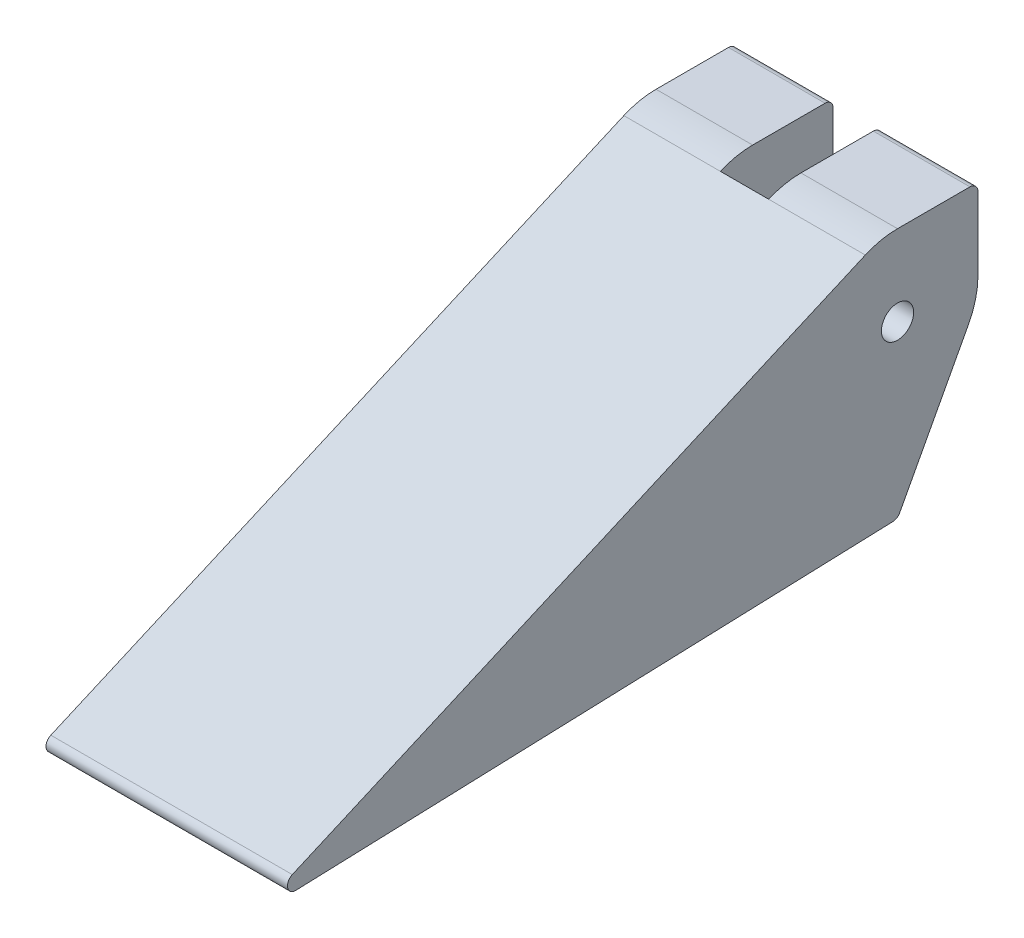
ISO-10303-21;
HEADER;
FILE_DESCRIPTION(('STEP AP214'),'2;1');
FILE_NAME('part.step','',(''),(''),'','','');
FILE_SCHEMA(('AUTOMOTIVE_DESIGN { 1 0 10303 214 1 1 1 1 }'));
ENDSEC;
DATA;
#1=APPLICATION_CONTEXT('core data for automotive mechanical design processes');
#2=APPLICATION_PROTOCOL_DEFINITION('international standard','automotive_design',2000,#1);
#3=PRODUCT_CONTEXT('',#1,'mechanical');
#4=PRODUCT('Part','Part','',(#3));
#5=PRODUCT_RELATED_PRODUCT_CATEGORY('part','',(#4));
#6=PRODUCT_DEFINITION_FORMATION('','',#4);
#7=PRODUCT_DEFINITION_CONTEXT('part definition',#1,'design');
#8=PRODUCT_DEFINITION('design','',#6,#7);
#9=PRODUCT_DEFINITION_SHAPE('','',#8);
#10=(LENGTH_UNIT() NAMED_UNIT(*) SI_UNIT(.MILLI.,.METRE.));
#11=(NAMED_UNIT(*) PLANE_ANGLE_UNIT() SI_UNIT($,.RADIAN.));
#12=(NAMED_UNIT(*) SI_UNIT($,.STERADIAN.) SOLID_ANGLE_UNIT());
#13=UNCERTAINTY_MEASURE_WITH_UNIT(LENGTH_MEASURE(1.E-05),#10,'distance_accuracy_value','');
#14=(GEOMETRIC_REPRESENTATION_CONTEXT(3) GLOBAL_UNCERTAINTY_ASSIGNED_CONTEXT((#13)) GLOBAL_UNIT_ASSIGNED_CONTEXT((#10,
#11,#12)) REPRESENTATION_CONTEXT('',''));
#15=CARTESIAN_POINT('',(0.,0.,0.));
#16=DIRECTION('',(0.,0.,1.));
#17=DIRECTION('',(1.,0.,0.));
#18=AXIS2_PLACEMENT_3D('',#15,#16,#17);
#19=CARTESIAN_POINT('',(38.1,0.,0.));
#20=DIRECTION('',(-1.,0.,0.));
#21=DIRECTION('',(0.,0.,1.));
#22=AXIS2_PLACEMENT_3D('',#19,#20,#21);
#23=CYLINDRICAL_SURFACE('',#22,12.7);
#24=CARTESIAN_POINT('',(15.24,0.,0.));
#25=DIRECTION('',(1.,0.,0.));
#26=DIRECTION('',(0.,0.,-1.));
#27=AXIS2_PLACEMENT_3D('',#24,#25,#26);
#28=CIRCLE('',#27,12.7);
#29=CARTESIAN_POINT('',(15.24,-5.9887754953725,-11.1993110531865));
#30=VERTEX_POINT('',#29);
#31=CARTESIAN_POINT('',(15.24,0.,-12.7));
#32=VERTEX_POINT('',#31);
#33=EDGE_CURVE('E256',#30,#32,#28,.T.);
#34=ORIENTED_EDGE('',*,*,#33,.F.);
#35=DIRECTION('',(-1.,0.,0.));
#36=VECTOR('',#35,1.);
#37=CARTESIAN_POINT('',(38.1,-5.9887754953725,-11.1993110531865));
#38=LINE('',#37,#36);
#39=CARTESIAN_POINT('',(0.,-5.9887754953725,-11.1993110531865));
#40=VERTEX_POINT('',#39);
#41=EDGE_CURVE('E103',#30,#40,#38,.T.);
#42=ORIENTED_EDGE('',*,*,#41,.T.);
#43=CARTESIAN_POINT('',(0.,0.,0.));
#44=DIRECTION('',(1.,0.,0.));
#45=DIRECTION('',(0.,0.,-1.));
#46=AXIS2_PLACEMENT_3D('',#43,#44,#45);
#47=CIRCLE('',#46,12.7);
#48=CARTESIAN_POINT('',(0.,0.,-12.7));
#49=VERTEX_POINT('',#48);
#50=EDGE_CURVE('E162',#40,#49,#47,.T.);
#51=ORIENTED_EDGE('',*,*,#50,.T.);
#52=DIRECTION('',(-1.,0.,0.));
#53=VECTOR('',#52,1.);
#54=CARTESIAN_POINT('',(38.1,0.,-12.7));
#55=LINE('',#54,#53);
#56=EDGE_CURVE('E211',#32,#49,#55,.T.);
#57=ORIENTED_EDGE('',*,*,#56,.F.);
#58=EDGE_LOOP('',(#34,#42,#51,#57));
#59=FACE_BOUND('',#58,.T.);
#60=ADVANCED_FACE('F39',(#59),#23,.T.);
#61=CARTESIAN_POINT('',(38.1,0.,-12.7));
#62=DIRECTION('',(0.,0.,1.));
#63=DIRECTION('',(1.,0.,0.));
#64=AXIS2_PLACEMENT_3D('',#61,#62,#63);
#65=PLANE('',#64);
#66=DIRECTION('',(0.,1.,0.));
#67=VECTOR('',#66,1.);
#68=CARTESIAN_POINT('',(15.24,0.,-12.7));
#69=LINE('',#68,#67);
#70=CARTESIAN_POINT('',(15.24,11.43,-12.7));
#71=VERTEX_POINT('',#70);
#72=EDGE_CURVE('E259',#32,#71,#69,.T.);
#73=ORIENTED_EDGE('',*,*,#72,.F.);
#74=ORIENTED_EDGE('',*,*,#56,.T.);
#75=DIRECTION('',(0.,1.,0.));
#76=VECTOR('',#75,1.);
#77=CARTESIAN_POINT('',(0.,0.,-12.7));
#78=LINE('',#77,#76);
#79=CARTESIAN_POINT('',(0.,11.43,-12.7));
#80=VERTEX_POINT('',#79);
#81=EDGE_CURVE('E164',#49,#80,#78,.T.);
#82=ORIENTED_EDGE('',*,*,#81,.T.);
#83=DIRECTION('',(-1.,0.,0.));
#84=VECTOR('',#83,1.);
#85=CARTESIAN_POINT('',(38.1,11.43,-12.7));
#86=LINE('',#85,#84);
#87=EDGE_CURVE('E207',#71,#80,#86,.T.);
#88=ORIENTED_EDGE('',*,*,#87,.F.);
#89=EDGE_LOOP('',(#73,#74,#82,#88));
#90=FACE_BOUND('',#89,.T.);
#91=ADVANCED_FACE('F400',(#90),#65,.F.);
#92=CARTESIAN_POINT('',(38.1,11.43,-11.43));
#93=DIRECTION('',(-1.,0.,0.));
#94=DIRECTION('',(0.,0.,1.));
#95=AXIS2_PLACEMENT_3D('',#92,#93,#94);
#96=CYLINDRICAL_SURFACE('',#95,1.27);
#97=CARTESIAN_POINT('',(15.24,11.43,-11.43));
#98=DIRECTION('',(1.,0.,0.));
#99=DIRECTION('',(0.,0.,-1.));
#100=AXIS2_PLACEMENT_3D('',#97,#98,#99);
#101=CIRCLE('',#100,1.27);
#102=CARTESIAN_POINT('',(15.24,12.7,-11.43));
#103=VERTEX_POINT('',#102);
#104=EDGE_CURVE('E262',#71,#103,#101,.T.);
#105=ORIENTED_EDGE('',*,*,#104,.F.);
#106=ORIENTED_EDGE('',*,*,#87,.T.);
#107=CARTESIAN_POINT('',(0.,11.43,-11.43));
#108=DIRECTION('',(1.,0.,0.));
#109=DIRECTION('',(0.,0.,-1.));
#110=AXIS2_PLACEMENT_3D('',#107,#108,#109);
#111=CIRCLE('',#110,1.27);
#112=CARTESIAN_POINT('',(0.,12.7,-11.43));
#113=VERTEX_POINT('',#112);
#114=EDGE_CURVE('E168',#80,#113,#111,.T.);
#115=ORIENTED_EDGE('',*,*,#114,.T.);
#116=DIRECTION('',(-1.,0.,0.));
#117=VECTOR('',#116,1.);
#118=CARTESIAN_POINT('',(38.1,12.7,-11.43));
#119=LINE('',#118,#117);
#120=EDGE_CURVE('E203',#103,#113,#119,.T.);
#121=ORIENTED_EDGE('',*,*,#120,.F.);
#122=EDGE_LOOP('',(#105,#106,#115,#121));
#123=FACE_BOUND('',#122,.T.);
#124=ADVANCED_FACE('F405',(#123),#96,.T.);
#125=CARTESIAN_POINT('',(38.1,12.7,-11.43));
#126=DIRECTION('',(0.,-1.,0.));
#127=DIRECTION('',(0.,0.,-1.));
#128=AXIS2_PLACEMENT_3D('',#125,#126,#127);
#129=PLANE('',#128);
#130=DIRECTION('',(0.,0.,1.));
#131=VECTOR('',#130,1.);
#132=CARTESIAN_POINT('',(15.24,12.7,-11.43));
#133=LINE('',#132,#131);
#134=CARTESIAN_POINT('',(15.24,12.7,0.));
#135=VERTEX_POINT('',#134);
#136=EDGE_CURVE('E265',#103,#135,#133,.T.);
#137=ORIENTED_EDGE('',*,*,#136,.F.);
#138=ORIENTED_EDGE('',*,*,#120,.T.);
#139=DIRECTION('',(0.,0.,1.));
#140=VECTOR('',#139,1.);
#141=CARTESIAN_POINT('',(0.,12.7,-11.43));
#142=LINE('',#141,#140);
#143=CARTESIAN_POINT('',(0.,12.7,0.));
#144=VERTEX_POINT('',#143);
#145=EDGE_CURVE('E171',#113,#144,#142,.T.);
#146=ORIENTED_EDGE('',*,*,#145,.T.);
#147=DIRECTION('',(-1.,0.,0.));
#148=VECTOR('',#147,1.);
#149=CARTESIAN_POINT('',(38.1,12.7,0.));
#150=LINE('',#149,#148);
#151=EDGE_CURVE('E199',#135,#144,#150,.T.);
#152=ORIENTED_EDGE('',*,*,#151,.F.);
#153=EDGE_LOOP('',(#137,#138,#146,#152));
#154=FACE_BOUND('',#153,.T.);
#155=ADVANCED_FACE('F436',(#154),#129,.F.);
#156=CARTESIAN_POINT('',(38.1,0.,0.));
#157=DIRECTION('',(-1.,0.,0.));
#158=DIRECTION('',(0.,0.,1.));
#159=AXIS2_PLACEMENT_3D('',#156,#157,#158);
#160=CYLINDRICAL_SURFACE('',#159,12.7);
#161=CARTESIAN_POINT('',(15.24,0.,0.));
#162=DIRECTION('',(1.,0.,0.));
#163=DIRECTION('',(0.,0.,-1.));
#164=AXIS2_PLACEMENT_3D('',#161,#162,#163);
#165=CIRCLE('',#164,12.7);
#166=CARTESIAN_POINT('',(15.24,11.6399650462695,5.07948951388084));
#167=VERTEX_POINT('',#166);
#168=EDGE_CURVE('E268',#135,#167,#165,.T.);
#169=ORIENTED_EDGE('',*,*,#168,.F.);
#170=ORIENTED_EDGE('',*,*,#151,.T.);
#171=CARTESIAN_POINT('',(0.,0.,0.));
#172=DIRECTION('',(1.,0.,0.));
#173=DIRECTION('',(0.,0.,-1.));
#174=AXIS2_PLACEMENT_3D('',#171,#172,#173);
#175=CIRCLE('',#174,12.7);
#176=CARTESIAN_POINT('',(0.,11.6399650462695,5.07948951388083));
#177=VERTEX_POINT('',#176);
#178=EDGE_CURVE('E174',#144,#177,#175,.T.);
#179=ORIENTED_EDGE('',*,*,#178,.T.);
#180=DIRECTION('',(-1.,0.,0.));
#181=VECTOR('',#180,1.);
#182=CARTESIAN_POINT('',(38.1,11.6399650462695,5.07948951388083));
#183=LINE('',#182,#181);
#184=EDGE_CURVE('E195',#167,#177,#183,.T.);
#185=ORIENTED_EDGE('',*,*,#184,.F.);
#186=EDGE_LOOP('',(#169,#170,#179,#185));
#187=FACE_BOUND('',#186,.T.);
#188=ADVANCED_FACE('F433',(#187),#160,.T.);
#189=CARTESIAN_POINT('',(38.1,0.,0.));
#190=DIRECTION('',(-1.,0.,0.));
#191=DIRECTION('',(0.,0.,1.));
#192=AXIS2_PLACEMENT_3D('',#189,#190,#191);
#193=CYLINDRICAL_SURFACE('',#192,2.54);
#194=CARTESIAN_POINT('',(0.,0.,0.));
#195=DIRECTION('',(1.,0.,0.));
#196=DIRECTION('',(0.,0.,-1.));
#197=AXIS2_PLACEMENT_3D('',#194,#195,#196);
#198=CIRCLE('',#197,2.54);
#199=CARTESIAN_POINT('',(0.,0.,2.54));
#200=VERTEX_POINT('',#199);
#201=EDGE_CURVE('E292',#200,#200,#198,.T.);
#202=CARTESIAN_POINT('',(15.24,0.,0.));
#203=DIRECTION('',(1.,0.,0.));
#204=DIRECTION('',(0.,0.,-1.));
#205=AXIS2_PLACEMENT_3D('',#202,#203,#204);
#206=CIRCLE('',#205,2.54);
#207=CARTESIAN_POINT('',(15.24,0.,2.54));
#208=VERTEX_POINT('',#207);
#209=EDGE_CURVE('E214',#208,#208,#206,.T.);
#210=CARTESIAN_POINT('',(0.,0.,2.54));
#211=CARTESIAN_POINT('',(0.158749999999999,0.,2.54));
#212=CARTESIAN_POINT('',(0.317499999999998,0.,2.54));
#213=CARTESIAN_POINT('',(0.634999999999999,0.,2.54));
#214=CARTESIAN_POINT('',(0.793750000000001,0.,2.54));
#215=CARTESIAN_POINT('',(1.11125,0.,2.54));
#216=CARTESIAN_POINT('',(1.27,0.,2.54));
#217=CARTESIAN_POINT('',(1.5875,0.,2.54));
#218=CARTESIAN_POINT('',(1.74625,0.,2.54));
#219=CARTESIAN_POINT('',(2.06375,0.,2.54));
#220=CARTESIAN_POINT('',(2.2225,0.,2.54));
#221=CARTESIAN_POINT('',(2.54,0.,2.54));
#222=CARTESIAN_POINT('',(2.69875,0.,2.54));
#223=CARTESIAN_POINT('',(3.01625,0.,2.54));
#224=CARTESIAN_POINT('',(3.175,0.,2.54));
#225=CARTESIAN_POINT('',(3.4925,0.,2.54));
#226=CARTESIAN_POINT('',(3.65125,0.,2.54));
#227=CARTESIAN_POINT('',(3.96875,0.,2.54));
#228=CARTESIAN_POINT('',(4.1275,0.,2.54));
#229=CARTESIAN_POINT('',(4.445,0.,2.54));
#230=CARTESIAN_POINT('',(4.60375,0.,2.54));
#231=CARTESIAN_POINT('',(4.92125,0.,2.54));
#232=CARTESIAN_POINT('',(5.08,0.,2.54));
#233=CARTESIAN_POINT('',(5.3975,0.,2.54));
#234=CARTESIAN_POINT('',(5.55625,0.,2.54));
#235=CARTESIAN_POINT('',(5.87375,0.,2.54));
#236=CARTESIAN_POINT('',(6.0325,0.,2.54));
#237=CARTESIAN_POINT('',(6.35,0.,2.54));
#238=CARTESIAN_POINT('',(6.50875,0.,2.54));
#239=CARTESIAN_POINT('',(6.82625,0.,2.54));
#240=CARTESIAN_POINT('',(6.985,0.,2.54));
#241=CARTESIAN_POINT('',(7.3025,0.,2.54));
#242=CARTESIAN_POINT('',(7.46125,0.,2.54));
#243=CARTESIAN_POINT('',(7.77875,0.,2.54));
#244=CARTESIAN_POINT('',(7.9375,0.,2.54));
#245=CARTESIAN_POINT('',(8.255,0.,2.54));
#246=CARTESIAN_POINT('',(8.41375,0.,2.54));
#247=CARTESIAN_POINT('',(8.73125,0.,2.54));
#248=CARTESIAN_POINT('',(8.89,0.,2.54));
#249=CARTESIAN_POINT('',(9.2075,0.,2.54));
#250=CARTESIAN_POINT('',(9.36625,0.,2.54));
#251=CARTESIAN_POINT('',(9.68375,0.,2.54));
#252=CARTESIAN_POINT('',(9.8425,0.,2.54));
#253=CARTESIAN_POINT('',(10.16,0.,2.54));
#254=CARTESIAN_POINT('',(10.31875,0.,2.54));
#255=CARTESIAN_POINT('',(10.63625,0.,2.54));
#256=CARTESIAN_POINT('',(10.795,0.,2.54));
#257=CARTESIAN_POINT('',(11.1125,0.,2.54));
#258=CARTESIAN_POINT('',(11.27125,0.,2.54));
#259=CARTESIAN_POINT('',(11.58875,0.,2.54));
#260=CARTESIAN_POINT('',(11.7475,0.,2.54));
#261=CARTESIAN_POINT('',(12.065,0.,2.54));
#262=CARTESIAN_POINT('',(12.22375,0.,2.54));
#263=CARTESIAN_POINT('',(12.54125,0.,2.54));
#264=CARTESIAN_POINT('',(12.7,0.,2.54));
#265=CARTESIAN_POINT('',(13.0175,0.,2.54));
#266=CARTESIAN_POINT('',(13.17625,0.,2.54));
#267=CARTESIAN_POINT('',(13.49375,0.,2.54));
#268=CARTESIAN_POINT('',(13.6525,0.,2.54));
#269=CARTESIAN_POINT('',(13.97,0.,2.54));
#270=CARTESIAN_POINT('',(14.12875,0.,2.54));
#271=CARTESIAN_POINT('',(14.44625,0.,2.54));
#272=CARTESIAN_POINT('',(14.605,0.,2.54));
#273=CARTESIAN_POINT('',(14.9225,0.,2.54));
#274=CARTESIAN_POINT('',(15.08125,0.,2.54));
#275=CARTESIAN_POINT('',(15.24,0.,2.54));
#276=B_SPLINE_CURVE_WITH_KNOTS('',3,(#210,#211,#212,#213,#214,#215,#216,#217,#218,#219,#220,
#221,#222,#223,#224,#225,#226,#227,#228,#229,#230,#231,#232,#233,#234,#235,#236,#237,#238,#239,
#240,#241,#242,#243,#244,#245,#246,#247,#248,#249,#250,#251,#252,#253,#254,#255,#256,#257,#258,
#259,#260,#261,#262,#263,#264,#265,#266,#267,#268,#269,#270,#271,#272,#273,#274,#275),
.UNSPECIFIED.,.F.,.F.,(4,2,2,2,2,2,2,2,2,2,2,2,2,2,2,2,2,2,2,2,2,2,2,2,2,2,2,2,2,2,2,2,4),(0.,
0.476249999999998,0.952500000000002,1.42875,1.905,2.38125,2.8575,3.33375,3.81,4.28625,4.7625,
5.23875,5.715,6.19125,6.6675,7.14375,7.62,8.09625,8.5725,9.04875,9.525,10.00125,10.4775,
10.95375,11.43,11.90625,12.3825,12.85875,13.335,13.81125,14.2875,14.76375,15.24),.UNSPECIFIED.);
#277=EDGE_CURVE('BSEAM418',#200,#208,#276,.T.);
#278=ORIENTED_EDGE('',*,*,#201,.F.);
#279=ORIENTED_EDGE('',*,*,#209,.T.);
#280=ORIENTED_EDGE('',*,*,#277,.T.);
#281=ORIENTED_EDGE('',*,*,#277,.F.);
#282=EDGE_LOOP('',(#278,#280,#279,#281));
#283=FACE_BOUND('',#282,.T.);
#284=ADVANCED_FACE('F418',(#283),#193,.F.);
#285=CARTESIAN_POINT('',(38.1,0.,0.));
#286=DIRECTION('',(1.,0.,0.));
#287=DIRECTION('',(0.,0.,-1.));
#288=AXIS2_PLACEMENT_3D('',#285,#286,#287);
#289=PLANE('',#288);
#290=CARTESIAN_POINT('',(38.1,0.,0.));
#291=DIRECTION('',(1.,0.,0.));
#292=DIRECTION('',(0.,0.,-1.));
#293=AXIS2_PLACEMENT_3D('',#290,#291,#292);
#294=CIRCLE('',#293,12.7);
#295=CARTESIAN_POINT('',(38.1,-5.9887754953725,-11.1993110531865));
#296=VERTEX_POINT('',#295);
#297=CARTESIAN_POINT('',(38.1,0.,-12.7));
#298=VERTEX_POINT('',#297);
#299=EDGE_CURVE('E186',#296,#298,#294,.T.);
#300=ORIENTED_EDGE('',*,*,#299,.T.);
#301=DIRECTION('',(0.,1.,0.));
#302=VECTOR('',#301,1.);
#303=CARTESIAN_POINT('',(38.1,0.,-12.7));
#304=LINE('',#303,#302);
#305=CARTESIAN_POINT('',(38.1,11.43,-12.7));
#306=VERTEX_POINT('',#305);
#307=EDGE_CURVE('E112',#298,#306,#304,.T.);
#308=ORIENTED_EDGE('',*,*,#307,.T.);
#309=CARTESIAN_POINT('',(38.1,11.43,-11.43));
#310=DIRECTION('',(1.,0.,0.));
#311=DIRECTION('',(0.,0.,-1.));
#312=AXIS2_PLACEMENT_3D('',#309,#310,#311);
#313=CIRCLE('',#312,1.27);
#314=CARTESIAN_POINT('',(38.1,12.7,-11.43));
#315=VERTEX_POINT('',#314);
#316=EDGE_CURVE('E299',#306,#315,#313,.T.);
#317=ORIENTED_EDGE('',*,*,#316,.T.);
#318=DIRECTION('',(0.,0.,1.));
#319=VECTOR('',#318,1.);
#320=CARTESIAN_POINT('',(38.1,12.7,-11.43));
#321=LINE('',#320,#319);
#322=CARTESIAN_POINT('',(38.1,12.7,0.));
#323=VERTEX_POINT('',#322);
#324=EDGE_CURVE('E301',#315,#323,#321,.T.);
#325=ORIENTED_EDGE('',*,*,#324,.T.);
#326=CARTESIAN_POINT('',(38.1,0.,0.));
#327=DIRECTION('',(1.,0.,0.));
#328=DIRECTION('',(0.,0.,-1.));
#329=AXIS2_PLACEMENT_3D('',#326,#327,#328);
#330=CIRCLE('',#329,12.7);
#331=CARTESIAN_POINT('',(38.1,11.6399650462695,5.07948951388083));
#332=VERTEX_POINT('',#331);
#333=EDGE_CURVE('E303',#323,#332,#330,.T.);
#334=ORIENTED_EDGE('',*,*,#333,.T.);
#335=DIRECTION('',(0.,-0.399959804242585,0.916532680808618));
#336=VECTOR('',#335,1.);
#337=CARTESIAN_POINT('',(38.1,11.6399650462695,5.07948951388083));
#338=LINE('',#337,#336);
#339=CARTESIAN_POINT('',(38.1,-27.8141628310713,95.4910688996249));
#340=VERTEX_POINT('',#339);
#341=EDGE_CURVE('E305',#332,#340,#338,.T.);
#342=ORIENTED_EDGE('',*,*,#341,.T.);
#343=CARTESIAN_POINT('',(38.1,-28.9781593356983,94.9831199482369));
#344=DIRECTION('',(1.,0.,0.));
#345=DIRECTION('',(0.,0.,1.));
#346=AXIS2_PLACEMENT_3D('',#343,#344,#345);
#347=CIRCLE('',#346,1.27);
#348=CARTESIAN_POINT('',(38.1,-30.2473856860126,94.9387975874246));
#349=VERTEX_POINT('',#348);
#350=EDGE_CURVE('E141',#340,#349,#347,.T.);
#351=ORIENTED_EDGE('',*,*,#350,.T.);
#352=DIRECTION('',(0.,0.0348994967025043,-0.999390827019096));
#353=VECTOR('',#352,1.);
#354=CARTESIAN_POINT('',(38.1,-26.9575695559175,0.730789631810402));
#355=LINE('',#354,#353);
#356=CARTESIAN_POINT('',(38.1,-26.9575695559175,0.730789631810402));
#357=VERTEX_POINT('',#356);
#358=EDGE_CURVE('E133',#349,#357,#355,.T.);
#359=ORIENTED_EDGE('',*,*,#358,.T.);
#360=CARTESIAN_POINT('',(38.1,-25.6883432056032,0.775111992622577));
#361=DIRECTION('',(1.,0.,0.));
#362=DIRECTION('',(0.,0.,1.));
#363=AXIS2_PLACEMENT_3D('',#360,#361,#362);
#364=CIRCLE('',#363,1.27);
#365=CARTESIAN_POINT('',(38.1,-26.2872207551405,-0.344819112696079));
#366=VERTEX_POINT('',#365);
#367=EDGE_CURVE('E138',#357,#366,#364,.T.);
#368=ORIENTED_EDGE('',*,*,#367,.T.);
#369=DIRECTION('',(0.,0.881835515998939,-0.471557125619882));
#370=VECTOR('',#369,1.);
#371=CARTESIAN_POINT('',(38.1,-5.9887754953725,-11.1993110531865));
#372=LINE('',#371,#370);
#373=EDGE_CURVE('E63',#366,#296,#372,.T.);
#374=ORIENTED_EDGE('',*,*,#373,.T.);
#375=EDGE_LOOP('',(#300,#308,#317,#325,#334,#342,#351,#359,#368,#374));
#376=FACE_BOUND('',#375,.T.);
#377=CARTESIAN_POINT('',(38.1,0.,0.));
#378=DIRECTION('',(1.,0.,0.));
#379=DIRECTION('',(0.,0.,-1.));
#380=AXIS2_PLACEMENT_3D('',#377,#378,#379);
#381=CIRCLE('',#380,2.54);
#382=CARTESIAN_POINT('',(38.1,0.,2.54));
#383=VERTEX_POINT('',#382);
#384=EDGE_CURVE('E165',#383,#383,#381,.T.);
#385=ORIENTED_EDGE('',*,*,#384,.F.);
#386=EDGE_LOOP('',(#385));
#387=FACE_BOUND('',#386,.T.);
#388=ADVANCED_FACE('F135',(#376,#387),#289,.T.);
#389=CARTESIAN_POINT('',(0.,0.,0.));
#390=DIRECTION('',(1.,0.,0.));
#391=DIRECTION('',(0.,0.,-1.));
#392=AXIS2_PLACEMENT_3D('',#389,#390,#391);
#393=PLANE('',#392);
#394=ORIENTED_EDGE('',*,*,#50,.F.);
#395=DIRECTION('',(0.,0.881835515998939,-0.471557125619882));
#396=VECTOR('',#395,1.);
#397=CARTESIAN_POINT('',(0.,-5.9887754953725,-11.1993110531865));
#398=LINE('',#397,#396);
#399=CARTESIAN_POINT('',(0.,-26.2872207551405,-0.344819112696079));
#400=VERTEX_POINT('',#399);
#401=EDGE_CURVE('E184',#400,#40,#398,.T.);
#402=ORIENTED_EDGE('',*,*,#401,.F.);
#403=CARTESIAN_POINT('',(0.,-25.6883432056032,0.775111992622577));
#404=DIRECTION('',(1.,0.,0.));
#405=DIRECTION('',(0.,0.,1.));
#406=AXIS2_PLACEMENT_3D('',#403,#404,#405);
#407=CIRCLE('',#406,1.27);
#408=CARTESIAN_POINT('',(0.,-26.9575695559175,0.730789631810402));
#409=VERTEX_POINT('',#408);
#410=EDGE_CURVE('E182',#409,#400,#407,.T.);
#411=ORIENTED_EDGE('',*,*,#410,.F.);
#412=DIRECTION('',(0.,0.0348994967025043,-0.999390827019096));
#413=VECTOR('',#412,1.);
#414=CARTESIAN_POINT('',(0.,-26.9575695559175,0.730789631810402));
#415=LINE('',#414,#413);
#416=CARTESIAN_POINT('',(0.,-30.2473856860126,94.9387975874246));
#417=VERTEX_POINT('',#416);
#418=EDGE_CURVE('E150',#417,#409,#415,.T.);
#419=ORIENTED_EDGE('',*,*,#418,.F.);
#420=CARTESIAN_POINT('',(0.,-28.9781593356983,94.9831199482369));
#421=DIRECTION('',(1.,0.,0.));
#422=DIRECTION('',(0.,0.,1.));
#423=AXIS2_PLACEMENT_3D('',#420,#421,#422);
#424=CIRCLE('',#423,1.27);
#425=CARTESIAN_POINT('',(0.,-27.8141628310713,95.4910688996249));
#426=VERTEX_POINT('',#425);
#427=EDGE_CURVE('E179',#426,#417,#424,.T.);
#428=ORIENTED_EDGE('',*,*,#427,.F.);
#429=DIRECTION('',(0.,-0.399959804242585,0.916532680808618));
#430=VECTOR('',#429,1.);
#431=CARTESIAN_POINT('',(0.,11.6399650462695,5.07948951388083));
#432=LINE('',#431,#430);
#433=EDGE_CURVE('E177',#177,#426,#432,.T.);
#434=ORIENTED_EDGE('',*,*,#433,.F.);
#435=ORIENTED_EDGE('',*,*,#178,.F.);
#436=ORIENTED_EDGE('',*,*,#145,.F.);
#437=ORIENTED_EDGE('',*,*,#114,.F.);
#438=ORIENTED_EDGE('',*,*,#81,.F.);
#439=EDGE_LOOP('',(#394,#402,#411,#419,#428,#434,#435,#436,#437,#438));
#440=FACE_BOUND('',#439,.T.);
#441=ORIENTED_EDGE('',*,*,#201,.T.);
#442=EDGE_LOOP('',(#441));
#443=FACE_BOUND('',#442,.T.);
#444=ADVANCED_FACE('F318',(#440,#443),#393,.F.);
#445=CARTESIAN_POINT('',(22.86,-5.9887754953725,-11.1993110531865));
#446=VERTEX_POINT('',#445);
#447=EDGE_CURVE('E187',#296,#446,#38,.T.);
#448=ORIENTED_EDGE('',*,*,#447,.T.);
#449=CARTESIAN_POINT('',(22.86,0.,0.));
#450=DIRECTION('',(1.,0.,0.));
#451=DIRECTION('',(0.,0.,-1.));
#452=AXIS2_PLACEMENT_3D('',#449,#450,#451);
#453=CIRCLE('',#452,12.7);
#454=CARTESIAN_POINT('',(22.86,0.,-12.7));
#455=VERTEX_POINT('',#454);
#456=EDGE_CURVE('E274',#446,#455,#453,.T.);
#457=ORIENTED_EDGE('',*,*,#456,.T.);
#458=EDGE_CURVE('E212',#298,#455,#55,.T.);
#459=ORIENTED_EDGE('',*,*,#458,.F.);
#460=ORIENTED_EDGE('',*,*,#299,.F.);
#461=EDGE_LOOP('',(#448,#457,#459,#460));
#462=FACE_BOUND('',#461,.T.);
#463=ADVANCED_FACE('F41',(#462),#23,.T.);
#464=ORIENTED_EDGE('',*,*,#458,.T.);
#465=DIRECTION('',(0.,1.,0.));
#466=VECTOR('',#465,1.);
#467=CARTESIAN_POINT('',(22.86,0.,-12.7));
#468=LINE('',#467,#466);
#469=CARTESIAN_POINT('',(22.86,11.43,-12.7));
#470=VERTEX_POINT('',#469);
#471=EDGE_CURVE('E277',#455,#470,#468,.T.);
#472=ORIENTED_EDGE('',*,*,#471,.T.);
#473=EDGE_CURVE('E208',#306,#470,#86,.T.);
#474=ORIENTED_EDGE('',*,*,#473,.F.);
#475=ORIENTED_EDGE('',*,*,#307,.F.);
#476=EDGE_LOOP('',(#464,#472,#474,#475));
#477=FACE_BOUND('',#476,.T.);
#478=ADVANCED_FACE('F326',(#477),#65,.F.);
#479=ORIENTED_EDGE('',*,*,#473,.T.);
#480=CARTESIAN_POINT('',(22.86,11.43,-11.43));
#481=DIRECTION('',(1.,0.,0.));
#482=DIRECTION('',(0.,0.,-1.));
#483=AXIS2_PLACEMENT_3D('',#480,#481,#482);
#484=CIRCLE('',#483,1.27);
#485=CARTESIAN_POINT('',(22.86,12.7,-11.43));
#486=VERTEX_POINT('',#485);
#487=EDGE_CURVE('E280',#470,#486,#484,.T.);
#488=ORIENTED_EDGE('',*,*,#487,.T.);
#489=EDGE_CURVE('E204',#315,#486,#119,.T.);
#490=ORIENTED_EDGE('',*,*,#489,.F.);
#491=ORIENTED_EDGE('',*,*,#316,.F.);
#492=EDGE_LOOP('',(#479,#488,#490,#491));
#493=FACE_BOUND('',#492,.T.);
#494=ADVANCED_FACE('F330',(#493),#96,.T.);
#495=ORIENTED_EDGE('',*,*,#489,.T.);
#496=DIRECTION('',(0.,0.,1.));
#497=VECTOR('',#496,1.);
#498=CARTESIAN_POINT('',(22.86,12.7,-11.43));
#499=LINE('',#498,#497);
#500=CARTESIAN_POINT('',(22.86,12.7,0.));
#501=VERTEX_POINT('',#500);
#502=EDGE_CURVE('E283',#486,#501,#499,.T.);
#503=ORIENTED_EDGE('',*,*,#502,.T.);
#504=EDGE_CURVE('E200',#323,#501,#150,.T.);
#505=ORIENTED_EDGE('',*,*,#504,.F.);
#506=ORIENTED_EDGE('',*,*,#324,.F.);
#507=EDGE_LOOP('',(#495,#503,#505,#506));
#508=FACE_BOUND('',#507,.T.);
#509=ADVANCED_FACE('F336',(#508),#129,.F.);
#510=ORIENTED_EDGE('',*,*,#504,.T.);
#511=CARTESIAN_POINT('',(22.86,0.,0.));
#512=DIRECTION('',(1.,0.,0.));
#513=DIRECTION('',(0.,0.,-1.));
#514=AXIS2_PLACEMENT_3D('',#511,#512,#513);
#515=CIRCLE('',#514,12.7);
#516=CARTESIAN_POINT('',(22.86,11.6399650462695,5.07948951388084));
#517=VERTEX_POINT('',#516);
#518=EDGE_CURVE('E286',#501,#517,#515,.T.);
#519=ORIENTED_EDGE('',*,*,#518,.T.);
#520=EDGE_CURVE('E196',#332,#517,#183,.T.);
#521=ORIENTED_EDGE('',*,*,#520,.F.);
#522=ORIENTED_EDGE('',*,*,#333,.F.);
#523=EDGE_LOOP('',(#510,#519,#521,#522));
#524=FACE_BOUND('',#523,.T.);
#525=ADVANCED_FACE('F340',(#524),#160,.T.);
#526=CARTESIAN_POINT('',(38.1,11.6399650462695,5.07948951388083));
#527=DIRECTION('',(0.,-0.916532680808618,-0.399959804242585));
#528=DIRECTION('',(0.,0.399959804242585,-0.916532680808618));
#529=AXIS2_PLACEMENT_3D('',#526,#527,#528);
#530=PLANE('',#529);
#531=ORIENTED_EDGE('',*,*,#520,.T.);
#532=DIRECTION('',(0.,-0.399959804242585,0.916532680808618));
#533=VECTOR('',#532,1.);
#534=CARTESIAN_POINT('',(22.86,11.6399650462695,5.07948951388083));
#535=LINE('',#534,#533);
#536=CARTESIAN_POINT('',(22.86,11.6397422785138,5.08));
#537=VERTEX_POINT('',#536);
#538=EDGE_CURVE('E289',#517,#537,#535,.T.);
#539=ORIENTED_EDGE('',*,*,#538,.T.);
#540=DIRECTION('',(-1.,0.,0.));
#541=VECTOR('',#540,1.);
#542=CARTESIAN_POINT('',(38.1,11.6397422785138,5.08));
#543=LINE('',#542,#541);
#544=CARTESIAN_POINT('',(15.24,11.6397422785138,5.08));
#545=VERTEX_POINT('',#544);
#546=EDGE_CURVE('E11',#537,#545,#543,.T.);
#547=ORIENTED_EDGE('',*,*,#546,.T.);
#548=DIRECTION('',(0.,-0.399959804242585,0.916532680808618));
#549=VECTOR('',#548,1.);
#550=CARTESIAN_POINT('',(15.24,11.6399650462695,5.07948951388083));
#551=LINE('',#550,#549);
#552=EDGE_CURVE('E222',#167,#545,#551,.T.);
#553=ORIENTED_EDGE('',*,*,#552,.F.);
#554=ORIENTED_EDGE('',*,*,#184,.T.);
#555=ORIENTED_EDGE('',*,*,#433,.T.);
#556=DIRECTION('',(-1.,0.,0.));
#557=VECTOR('',#556,1.);
#558=CARTESIAN_POINT('',(38.1,-27.8141628310713,95.4910688996249));
#559=LINE('',#558,#557);
#560=EDGE_CURVE('E192',#340,#426,#559,.T.);
#561=ORIENTED_EDGE('',*,*,#560,.F.);
#562=ORIENTED_EDGE('',*,*,#341,.F.);
#563=EDGE_LOOP('',(#531,#539,#547,#553,#554,#555,#561,#562));
#564=FACE_BOUND('',#563,.T.);
#565=ADVANCED_FACE('F311',(#564),#530,.F.);
#566=CARTESIAN_POINT('',(38.1,-28.9781593356983,94.9831199482369));
#567=DIRECTION('',(-1.,0.,0.));
#568=DIRECTION('',(0.,0.,1.));
#569=AXIS2_PLACEMENT_3D('',#566,#567,#568);
#570=CYLINDRICAL_SURFACE('',#569,1.27);
#571=ORIENTED_EDGE('',*,*,#427,.T.);
#572=DIRECTION('',(-1.,0.,0.));
#573=VECTOR('',#572,1.);
#574=CARTESIAN_POINT('',(38.1,-30.2473856860126,94.9387975874246));
#575=LINE('',#574,#573);
#576=EDGE_CURVE('E153',#349,#417,#575,.T.);
#577=ORIENTED_EDGE('',*,*,#576,.F.);
#578=ORIENTED_EDGE('',*,*,#350,.F.);
#579=ORIENTED_EDGE('',*,*,#560,.T.);
#580=EDGE_LOOP('',(#571,#577,#578,#579));
#581=FACE_BOUND('',#580,.T.);
#582=ADVANCED_FACE('F315',(#581),#570,.T.);
#583=CARTESIAN_POINT('',(38.1,-26.9575695559175,0.730789631810402));
#584=DIRECTION('',(0.,0.999390827019096,0.0348994967025043));
#585=DIRECTION('',(0.,-0.0348994967025043,0.999390827019096));
#586=AXIS2_PLACEMENT_3D('',#583,#584,#585);
#587=PLANE('',#586);
#588=ORIENTED_EDGE('',*,*,#418,.T.);
#589=DIRECTION('',(-1.,0.,0.));
#590=VECTOR('',#589,1.);
#591=CARTESIAN_POINT('',(38.1,-26.9575695559175,0.730789631810402));
#592=LINE('',#591,#590);
#593=EDGE_CURVE('E147',#357,#409,#592,.T.);
#594=ORIENTED_EDGE('',*,*,#593,.F.);
#595=ORIENTED_EDGE('',*,*,#358,.F.);
#596=ORIENTED_EDGE('',*,*,#576,.T.);
#597=EDGE_LOOP('',(#588,#594,#595,#596));
#598=FACE_BOUND('',#597,.T.);
#599=ADVANCED_FACE('F148',(#598),#587,.F.);
#600=CARTESIAN_POINT('',(38.1,-25.6883432056032,0.775111992622577));
#601=DIRECTION('',(-1.,0.,0.));
#602=DIRECTION('',(0.,0.,1.));
#603=AXIS2_PLACEMENT_3D('',#600,#601,#602);
#604=CYLINDRICAL_SURFACE('',#603,1.27);
#605=ORIENTED_EDGE('',*,*,#410,.T.);
#606=DIRECTION('',(-1.,0.,0.));
#607=VECTOR('',#606,1.);
#608=CARTESIAN_POINT('',(38.1,-26.2872207551405,-0.344819112696079));
#609=LINE('',#608,#607);
#610=EDGE_CURVE('E154',#366,#400,#609,.T.);
#611=ORIENTED_EDGE('',*,*,#610,.F.);
#612=ORIENTED_EDGE('',*,*,#367,.F.);
#613=ORIENTED_EDGE('',*,*,#593,.T.);
#614=EDGE_LOOP('',(#605,#611,#612,#613));
#615=FACE_BOUND('',#614,.T.);
#616=ADVANCED_FACE('F156',(#615),#604,.T.);
#617=CARTESIAN_POINT('',(38.1,-5.9887754953725,-11.1993110531865));
#618=DIRECTION('',(0.,0.471557125619882,0.881835515998939));
#619=DIRECTION('',(0.,-0.881835515998939,0.471557125619882));
#620=AXIS2_PLACEMENT_3D('',#617,#618,#619);
#621=PLANE('',#620);
#622=DIRECTION('',(1.,0.,0.));
#623=VECTOR('',#622,1.);
#624=CARTESIAN_POINT('',(38.1,-18.2247494476242,-4.65618526453262));
#625=LINE('',#624,#623);
#626=CARTESIAN_POINT('',(15.24,-18.2247494476242,-4.65618526453262));
#627=VERTEX_POINT('',#626);
#628=CARTESIAN_POINT('',(22.86,-18.2247494476242,-4.65618526453262));
#629=VERTEX_POINT('',#628);
#630=EDGE_CURVE('E47',#627,#629,#625,.T.);
#631=ORIENTED_EDGE('',*,*,#630,.T.);
#632=DIRECTION('',(0.,0.881835515998939,-0.471557125619882));
#633=VECTOR('',#632,1.);
#634=CARTESIAN_POINT('',(22.86,-5.9887754953725,-11.1993110531865));
#635=LINE('',#634,#633);
#636=EDGE_CURVE('E221',#629,#446,#635,.T.);
#637=ORIENTED_EDGE('',*,*,#636,.T.);
#638=ORIENTED_EDGE('',*,*,#447,.F.);
#639=ORIENTED_EDGE('',*,*,#373,.F.);
#640=ORIENTED_EDGE('',*,*,#610,.T.);
#641=ORIENTED_EDGE('',*,*,#401,.T.);
#642=ORIENTED_EDGE('',*,*,#41,.F.);
#643=DIRECTION('',(0.,0.881835515998939,-0.471557125619882));
#644=VECTOR('',#643,1.);
#645=CARTESIAN_POINT('',(15.24,-5.9887754953725,-11.1993110531865));
#646=LINE('',#645,#644);
#647=EDGE_CURVE('E217',#627,#30,#646,.T.);
#648=ORIENTED_EDGE('',*,*,#647,.F.);
#649=EDGE_LOOP('',(#631,#637,#638,#639,#640,#641,#642,#648));
#650=FACE_BOUND('',#649,.T.);
#651=ADVANCED_FACE('F228',(#650),#621,.F.);
#652=CARTESIAN_POINT('',(22.86,0.,0.));
#653=DIRECTION('',(1.,0.,0.));
#654=DIRECTION('',(0.,0.,-1.));
#655=AXIS2_PLACEMENT_3D('',#652,#653,#654);
#656=CIRCLE('',#655,2.54);
#657=CARTESIAN_POINT('',(22.86,0.,2.54));
#658=VERTEX_POINT('',#657);
#659=EDGE_CURVE('E219',#658,#658,#656,.T.);
#660=CARTESIAN_POINT('',(22.86,0.,2.54));
#661=CARTESIAN_POINT('',(23.01875,0.,2.54));
#662=CARTESIAN_POINT('',(23.1775,0.,2.54));
#663=CARTESIAN_POINT('',(23.495,0.,2.54));
#664=CARTESIAN_POINT('',(23.65375,0.,2.54));
#665=CARTESIAN_POINT('',(23.97125,0.,2.54));
#666=CARTESIAN_POINT('',(24.13,0.,2.54));
#667=CARTESIAN_POINT('',(24.4475,0.,2.54));
#668=CARTESIAN_POINT('',(24.60625,0.,2.54));
#669=CARTESIAN_POINT('',(24.92375,0.,2.54));
#670=CARTESIAN_POINT('',(25.0825,0.,2.54));
#671=CARTESIAN_POINT('',(25.4,0.,2.54));
#672=CARTESIAN_POINT('',(25.55875,0.,2.54));
#673=CARTESIAN_POINT('',(25.87625,0.,2.54));
#674=CARTESIAN_POINT('',(26.035,0.,2.54));
#675=CARTESIAN_POINT('',(26.3525,0.,2.54));
#676=CARTESIAN_POINT('',(26.51125,0.,2.54));
#677=CARTESIAN_POINT('',(26.82875,0.,2.54));
#678=CARTESIAN_POINT('',(26.9875,0.,2.54));
#679=CARTESIAN_POINT('',(27.305,0.,2.54));
#680=CARTESIAN_POINT('',(27.46375,0.,2.54));
#681=CARTESIAN_POINT('',(27.78125,0.,2.54));
#682=CARTESIAN_POINT('',(27.94,0.,2.54));
#683=CARTESIAN_POINT('',(28.2575,0.,2.54));
#684=CARTESIAN_POINT('',(28.41625,0.,2.54));
#685=CARTESIAN_POINT('',(28.73375,0.,2.54));
#686=CARTESIAN_POINT('',(28.8925,0.,2.54));
#687=CARTESIAN_POINT('',(29.21,0.,2.54));
#688=CARTESIAN_POINT('',(29.36875,0.,2.54));
#689=CARTESIAN_POINT('',(29.68625,0.,2.54));
#690=CARTESIAN_POINT('',(29.845,0.,2.54));
#691=CARTESIAN_POINT('',(30.1625,0.,2.54));
#692=CARTESIAN_POINT('',(30.32125,0.,2.54));
#693=CARTESIAN_POINT('',(30.63875,0.,2.54));
#694=CARTESIAN_POINT('',(30.7975,0.,2.54));
#695=CARTESIAN_POINT('',(31.115,0.,2.54));
#696=CARTESIAN_POINT('',(31.27375,0.,2.54));
#697=CARTESIAN_POINT('',(31.59125,0.,2.54));
#698=CARTESIAN_POINT('',(31.75,0.,2.54));
#699=CARTESIAN_POINT('',(32.0675,0.,2.54));
#700=CARTESIAN_POINT('',(32.22625,0.,2.54));
#701=CARTESIAN_POINT('',(32.54375,0.,2.54));
#702=CARTESIAN_POINT('',(32.7025,0.,2.54));
#703=CARTESIAN_POINT('',(33.02,0.,2.54));
#704=CARTESIAN_POINT('',(33.17875,0.,2.54));
#705=CARTESIAN_POINT('',(33.49625,0.,2.54));
#706=CARTESIAN_POINT('',(33.655,0.,2.54));
#707=CARTESIAN_POINT('',(33.9725,0.,2.54));
#708=CARTESIAN_POINT('',(34.13125,0.,2.54));
#709=CARTESIAN_POINT('',(34.44875,0.,2.54));
#710=CARTESIAN_POINT('',(34.6075,0.,2.54));
#711=CARTESIAN_POINT('',(34.925,0.,2.54));
#712=CARTESIAN_POINT('',(35.08375,0.,2.54));
#713=CARTESIAN_POINT('',(35.40125,0.,2.54));
#714=CARTESIAN_POINT('',(35.56,0.,2.54));
#715=CARTESIAN_POINT('',(35.8775,0.,2.54));
#716=CARTESIAN_POINT('',(36.03625,0.,2.54));
#717=CARTESIAN_POINT('',(36.35375,0.,2.54));
#718=CARTESIAN_POINT('',(36.5125,0.,2.54));
#719=CARTESIAN_POINT('',(36.83,0.,2.54));
#720=CARTESIAN_POINT('',(36.98875,0.,2.54));
#721=CARTESIAN_POINT('',(37.30625,0.,2.54));
#722=CARTESIAN_POINT('',(37.465,0.,2.54));
#723=CARTESIAN_POINT('',(37.7825,0.,2.54));
#724=CARTESIAN_POINT('',(37.94125,0.,2.54));
#725=CARTESIAN_POINT('',(38.1,0.,2.54));
#726=B_SPLINE_CURVE_WITH_KNOTS('',3,(#660,#661,#662,#663,#664,#665,#666,#667,#668,#669,#670,
#671,#672,#673,#674,#675,#676,#677,#678,#679,#680,#681,#682,#683,#684,#685,#686,#687,#688,#689,
#690,#691,#692,#693,#694,#695,#696,#697,#698,#699,#700,#701,#702,#703,#704,#705,#706,#707,#708,
#709,#710,#711,#712,#713,#714,#715,#716,#717,#718,#719,#720,#721,#722,#723,#724,#725),
.UNSPECIFIED.,.F.,.F.,(4,2,2,2,2,2,2,2,2,2,2,2,2,2,2,2,2,2,2,2,2,2,2,2,2,2,2,2,2,2,2,2,4),(0.,
0.476250000000001,0.952500000000002,1.42875,1.905,2.38125,2.8575,3.33375,3.81,4.28625,4.7625,
5.23875,5.715,6.19125,6.6675,7.14375,7.62,8.09625,8.5725,9.04875,9.525,10.00125,10.4775,
10.95375,11.43,11.90625,12.3825,12.85875,13.335,13.81125,14.2875,14.76375,15.24),.UNSPECIFIED.);
#727=EDGE_CURVE('BSEAM424',#658,#383,#726,.T.);
#728=ORIENTED_EDGE('',*,*,#659,.F.);
#729=ORIENTED_EDGE('',*,*,#384,.T.);
#730=ORIENTED_EDGE('',*,*,#727,.T.);
#731=ORIENTED_EDGE('',*,*,#727,.F.);
#732=EDGE_LOOP('',(#728,#730,#729,#731));
#733=FACE_BOUND('',#732,.T.);
#734=ADVANCED_FACE('F424',(#733),#193,.F.);
#735=CARTESIAN_POINT('',(22.86,0.,5.08));
#736=DIRECTION('',(0.,0.,1.));
#737=DIRECTION('',(1.,0.,0.));
#738=AXIS2_PLACEMENT_3D('',#735,#736,#737);
#739=PLANE('',#738);
#740=DIRECTION('',(0.,1.,0.));
#741=VECTOR('',#740,1.);
#742=CARTESIAN_POINT('',(22.86,0.,5.08));
#743=LINE('',#742,#741);
#744=CARTESIAN_POINT('',(22.86,0.,5.08));
#745=VERTEX_POINT('',#744);
#746=EDGE_CURVE('E249',#745,#537,#743,.T.);
#747=ORIENTED_EDGE('',*,*,#746,.F.);
#748=DIRECTION('',(-1.,0.,0.));
#749=VECTOR('',#748,1.);
#750=CARTESIAN_POINT('',(22.86,0.,5.08));
#751=LINE('',#750,#749);
#752=CARTESIAN_POINT('',(15.24,0.,5.08));
#753=VERTEX_POINT('',#752);
#754=EDGE_CURVE('E218',#745,#753,#751,.T.);
#755=ORIENTED_EDGE('',*,*,#754,.T.);
#756=DIRECTION('',(0.,1.,0.));
#757=VECTOR('',#756,1.);
#758=CARTESIAN_POINT('',(15.24,0.,5.08));
#759=LINE('',#758,#757);
#760=EDGE_CURVE('E378',#753,#545,#759,.T.);
#761=ORIENTED_EDGE('',*,*,#760,.T.);
#762=ORIENTED_EDGE('',*,*,#546,.F.);
#763=EDGE_LOOP('',(#747,#755,#761,#762));
#764=FACE_BOUND('',#763,.T.);
#765=ADVANCED_FACE('F377',(#764),#739,.F.);
#766=CARTESIAN_POINT('',(22.86,-2.53999999999998,4.39940905122497));
#767=DIRECTION('',(0.,-0.499999999999995,0.866025403784441));
#768=DIRECTION('',(0.,-0.866025403784441,-0.499999999999995));
#769=AXIS2_PLACEMENT_3D('',#766,#767,#768);
#770=PLANE('',#769);
#771=DIRECTION('',(0.,0.866025403784441,0.499999999999995));
#772=VECTOR('',#771,1.);
#773=CARTESIAN_POINT('',(15.24,-2.53999999999998,4.39940905122497));
#774=LINE('',#773,#772);
#775=CARTESIAN_POINT('',(15.24,-2.53999999999997,4.39940905122497));
#776=VERTEX_POINT('',#775);
#777=EDGE_CURVE('E54',#627,#776,#774,.T.);
#778=ORIENTED_EDGE('',*,*,#777,.T.);
#779=DIRECTION('',(-1.,0.,0.));
#780=VECTOR('',#779,1.);
#781=CARTESIAN_POINT('',(22.86,-2.53999999999997,4.39940905122497));
#782=LINE('',#781,#780);
#783=CARTESIAN_POINT('',(22.86,-2.53999999999997,4.39940905122497));
#784=VERTEX_POINT('',#783);
#785=EDGE_CURVE('E242',#784,#776,#782,.T.);
#786=ORIENTED_EDGE('',*,*,#785,.F.);
#787=DIRECTION('',(0.,0.866025403784441,0.499999999999995));
#788=VECTOR('',#787,1.);
#789=CARTESIAN_POINT('',(22.86,-2.53999999999998,4.39940905122497));
#790=LINE('',#789,#788);
#791=EDGE_CURVE('E240',#629,#784,#790,.T.);
#792=ORIENTED_EDGE('',*,*,#791,.F.);
#793=ORIENTED_EDGE('',*,*,#630,.F.);
#794=EDGE_LOOP('',(#778,#786,#792,#793));
#795=FACE_BOUND('',#794,.T.);
#796=ADVANCED_FACE('F235',(#795),#770,.F.);
#797=CARTESIAN_POINT('',(22.86,0.,0.));
#798=DIRECTION('',(1.,0.,0.));
#799=DIRECTION('',(0.,0.,-1.));
#800=AXIS2_PLACEMENT_3D('',#797,#798,#799);
#801=PLANE('',#800);
#802=ORIENTED_EDGE('',*,*,#659,.T.);
#803=EDGE_LOOP('',(#802));
#804=FACE_BOUND('',#803,.T.);
#805=ORIENTED_EDGE('',*,*,#518,.F.);
#806=ORIENTED_EDGE('',*,*,#502,.F.);
#807=ORIENTED_EDGE('',*,*,#487,.F.);
#808=ORIENTED_EDGE('',*,*,#471,.F.);
#809=ORIENTED_EDGE('',*,*,#456,.F.);
#810=ORIENTED_EDGE('',*,*,#636,.F.);
#811=ORIENTED_EDGE('',*,*,#791,.T.);
#812=CARTESIAN_POINT('',(22.86,0.,0.));
#813=DIRECTION('',(1.,0.,0.));
#814=DIRECTION('',(0.,0.,-1.));
#815=AXIS2_PLACEMENT_3D('',#812,#813,#814);
#816=CIRCLE('',#815,5.08);
#817=EDGE_CURVE('E246',#745,#784,#816,.T.);
#818=ORIENTED_EDGE('',*,*,#817,.F.);
#819=ORIENTED_EDGE('',*,*,#746,.T.);
#820=ORIENTED_EDGE('',*,*,#538,.F.);
#821=EDGE_LOOP('',(#805,#806,#807,#808,#809,#810,#811,#818,#819,#820));
#822=FACE_BOUND('',#821,.T.);
#823=ADVANCED_FACE('F388',(#804,#822),#801,.F.);
#824=CARTESIAN_POINT('',(15.24,0.,0.));
#825=DIRECTION('',(1.,0.,0.));
#826=DIRECTION('',(0.,0.,-1.));
#827=AXIS2_PLACEMENT_3D('',#824,#825,#826);
#828=PLANE('',#827);
#829=ORIENTED_EDGE('',*,*,#209,.F.);
#830=EDGE_LOOP('',(#829));
#831=FACE_BOUND('',#830,.T.);
#832=ORIENTED_EDGE('',*,*,#552,.T.);
#833=ORIENTED_EDGE('',*,*,#760,.F.);
#834=CARTESIAN_POINT('',(15.24,0.,0.));
#835=DIRECTION('',(1.,0.,0.));
#836=DIRECTION('',(0.,0.,-1.));
#837=AXIS2_PLACEMENT_3D('',#834,#835,#836);
#838=CIRCLE('',#837,5.08);
#839=EDGE_CURVE('E382',#753,#776,#838,.T.);
#840=ORIENTED_EDGE('',*,*,#839,.T.);
#841=ORIENTED_EDGE('',*,*,#777,.F.);
#842=ORIENTED_EDGE('',*,*,#647,.T.);
#843=ORIENTED_EDGE('',*,*,#33,.T.);
#844=ORIENTED_EDGE('',*,*,#72,.T.);
#845=ORIENTED_EDGE('',*,*,#104,.T.);
#846=ORIENTED_EDGE('',*,*,#136,.T.);
#847=ORIENTED_EDGE('',*,*,#168,.T.);
#848=EDGE_LOOP('',(#832,#833,#840,#841,#842,#843,#844,#845,#846,#847));
#849=FACE_BOUND('',#848,.T.);
#850=ADVANCED_FACE('F381',(#831,#849),#828,.T.);
#851=CARTESIAN_POINT('',(22.86,0.,0.));
#852=DIRECTION('',(-1.,0.,0.));
#853=DIRECTION('',(0.,0.,1.));
#854=AXIS2_PLACEMENT_3D('',#851,#852,#853);
#855=CYLINDRICAL_SURFACE('',#854,5.08);
#856=ORIENTED_EDGE('',*,*,#754,.F.);
#857=ORIENTED_EDGE('',*,*,#817,.T.);
#858=ORIENTED_EDGE('',*,*,#785,.T.);
#859=ORIENTED_EDGE('',*,*,#839,.F.);
#860=EDGE_LOOP('',(#856,#857,#858,#859));
#861=FACE_BOUND('',#860,.T.);
#862=ADVANCED_FACE('F385',(#861),#855,.F.);
#863=CLOSED_SHELL('',(#60,#91,#124,#155,#188,#284,#388,#444,#463,#478,#494,#509,#525,#565,#582,
#599,#616,#651,#734,#765,#796,#823,#850,#862));
#864=MANIFOLD_SOLID_BREP('B2',#863);
#865=ADVANCED_BREP_SHAPE_REPRESENTATION('',(#18,#864),#14);
#866=SHAPE_DEFINITION_REPRESENTATION(#9,#865);
ENDSEC;
END-ISO-10303-21;
